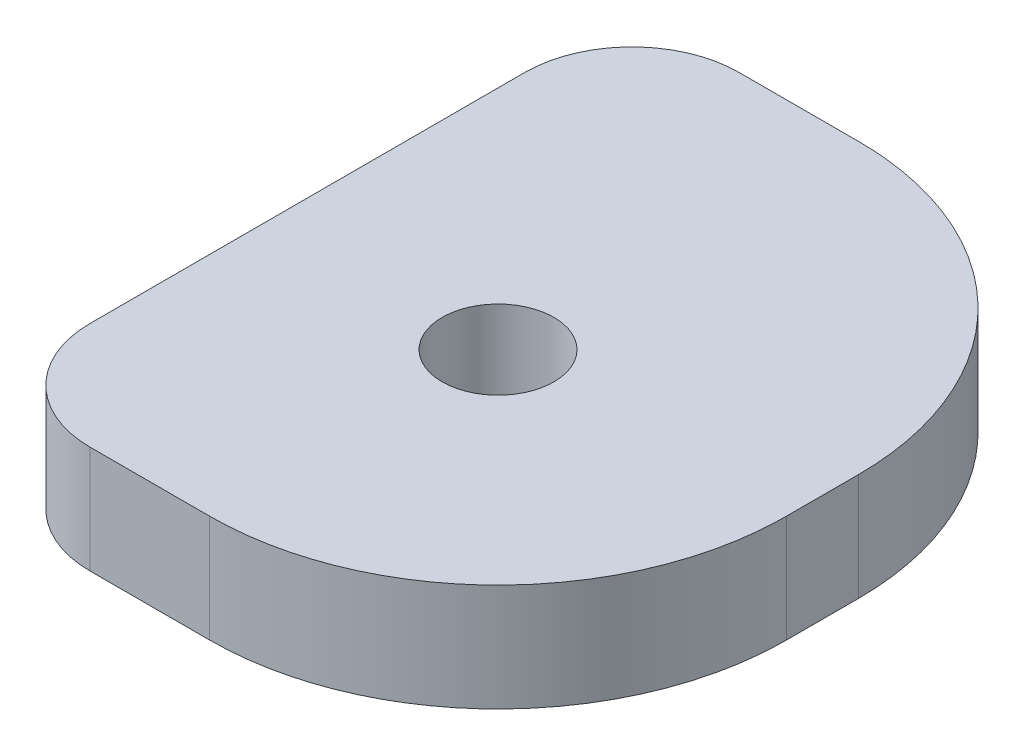
ISO-10303-21;
HEADER;
FILE_DESCRIPTION(('STEP AP214'),'2;1');
FILE_NAME('part.step','',(''),(''),'','','');
FILE_SCHEMA(('AUTOMOTIVE_DESIGN { 1 0 10303 214 1 1 1 1 }'));
ENDSEC;
DATA;
#1=APPLICATION_CONTEXT('core data for automotive mechanical design processes');
#2=APPLICATION_PROTOCOL_DEFINITION('international standard','automotive_design',2000,#1);
#3=PRODUCT_CONTEXT('',#1,'mechanical');
#4=PRODUCT('Part','Part','',(#3));
#5=PRODUCT_RELATED_PRODUCT_CATEGORY('part','',(#4));
#6=PRODUCT_DEFINITION_FORMATION('','',#4);
#7=PRODUCT_DEFINITION_CONTEXT('part definition',#1,'design');
#8=PRODUCT_DEFINITION('design','',#6,#7);
#9=PRODUCT_DEFINITION_SHAPE('','',#8);
#10=(LENGTH_UNIT() NAMED_UNIT(*) SI_UNIT(.MILLI.,.METRE.));
#11=(NAMED_UNIT(*) PLANE_ANGLE_UNIT() SI_UNIT($,.RADIAN.));
#12=(NAMED_UNIT(*) SI_UNIT($,.STERADIAN.) SOLID_ANGLE_UNIT());
#13=UNCERTAINTY_MEASURE_WITH_UNIT(LENGTH_MEASURE(1.E-05),#10,'distance_accuracy_value','');
#14=(GEOMETRIC_REPRESENTATION_CONTEXT(3) GLOBAL_UNCERTAINTY_ASSIGNED_CONTEXT((#13)) GLOBAL_UNIT_ASSIGNED_CONTEXT((#10,
#11,#12)) REPRESENTATION_CONTEXT('',''));
#15=CARTESIAN_POINT('',(0.,0.,0.));
#16=DIRECTION('',(0.,0.,1.));
#17=DIRECTION('',(1.,0.,0.));
#18=AXIS2_PLACEMENT_3D('',#15,#16,#17);
#19=CARTESIAN_POINT('',(-21.3572367696971,3.175,9.59648071784508));
#20=DIRECTION('',(0.,0.,-1.));
#21=DIRECTION('',(-1.,0.,0.));
#22=AXIS2_PLACEMENT_3D('',#19,#20,#21);
#23=PLANE('',#22);
#24=DIRECTION('',(1.,0.,0.));
#25=VECTOR('',#24,1.);
#26=CARTESIAN_POINT('',(-21.3572367696971,3.175,9.59648071784508));
#27=LINE('',#26,#25);
#28=CARTESIAN_POINT('',(9.24976323030285,3.175,9.59648071784508));
#29=VERTEX_POINT('',#28);
#30=CARTESIAN_POINT('',(12.7803632303029,3.175,9.59648071784508));
#31=VERTEX_POINT('',#30);
#32=EDGE_CURVE('E105',#29,#31,#27,.T.);
#33=ORIENTED_EDGE('',*,*,#32,.F.);
#34=DIRECTION('',(0.,-1.,0.));
#35=VECTOR('',#34,1.);
#36=CARTESIAN_POINT('',(9.24976323030285,0.,9.59648071784508));
#37=LINE('',#36,#35);
#38=CARTESIAN_POINT('',(9.24976323030285,0.,9.59648071784508));
#39=VERTEX_POINT('',#38);
#40=EDGE_CURVE('E134',#29,#39,#37,.T.);
#41=ORIENTED_EDGE('',*,*,#40,.T.);
#42=DIRECTION('',(1.,0.,0.));
#43=VECTOR('',#42,1.);
#44=CARTESIAN_POINT('',(-21.3572367696971,0.,9.59648071784508));
#45=LINE('',#44,#43);
#46=CARTESIAN_POINT('',(12.7803632303029,0.,9.59648071784508));
#47=VERTEX_POINT('',#46);
#48=EDGE_CURVE('E162',#39,#47,#45,.T.);
#49=ORIENTED_EDGE('',*,*,#48,.T.);
#50=DIRECTION('',(0.,-1.,0.));
#51=VECTOR('',#50,1.);
#52=CARTESIAN_POINT('',(12.7803632303029,3.175,9.59648071784508));
#53=LINE('',#52,#51);
#54=EDGE_CURVE('E153',#47,#31,#53,.F.);
#55=ORIENTED_EDGE('',*,*,#54,.T.);
#56=EDGE_LOOP('',(#33,#41,#49,#55));
#57=FACE_BOUND('',#56,.T.);
#58=ADVANCED_FACE('F34',(#57),#23,.F.);
#59=CARTESIAN_POINT('',(-21.3572367696971,3.175,-9.60591928215492));
#60=DIRECTION('',(0.,0.,1.));
#61=DIRECTION('',(1.,0.,0.));
#62=AXIS2_PLACEMENT_3D('',#59,#60,#61);
#63=PLANE('',#62);
#64=DIRECTION('',(-1.,0.,0.));
#65=VECTOR('',#64,1.);
#66=CARTESIAN_POINT('',(-21.3572367696971,0.,-9.60591928215492));
#67=LINE('',#66,#65);
#68=CARTESIAN_POINT('',(12.7803632303029,0.,-9.60591928215492));
#69=VERTEX_POINT('',#68);
#70=CARTESIAN_POINT('',(9.24976323030285,0.,-9.60591928215492));
#71=VERTEX_POINT('',#70);
#72=EDGE_CURVE('E154',#69,#71,#67,.T.);
#73=ORIENTED_EDGE('',*,*,#72,.T.);
#74=DIRECTION('',(0.,-1.,0.));
#75=VECTOR('',#74,1.);
#76=CARTESIAN_POINT('',(9.24976323030285,3.175,-9.60591928215492));
#77=LINE('',#76,#75);
#78=CARTESIAN_POINT('',(9.24976323030285,3.175,-9.60591928215492));
#79=VERTEX_POINT('',#78);
#80=EDGE_CURVE('E11',#71,#79,#77,.F.);
#81=ORIENTED_EDGE('',*,*,#80,.T.);
#82=DIRECTION('',(-1.,0.,0.));
#83=VECTOR('',#82,1.);
#84=CARTESIAN_POINT('',(-21.3572367696971,3.175,-9.60591928215492));
#85=LINE('',#84,#83);
#86=CARTESIAN_POINT('',(12.7803632303029,3.175,-9.60591928215492));
#87=VERTEX_POINT('',#86);
#88=EDGE_CURVE('E120',#87,#79,#85,.T.);
#89=ORIENTED_EDGE('',*,*,#88,.F.);
#90=DIRECTION('',(0.,-1.,0.));
#91=VECTOR('',#90,1.);
#92=CARTESIAN_POINT('',(12.7803632303029,3.175,-9.60591928215492));
#93=LINE('',#92,#91);
#94=EDGE_CURVE('E126',#87,#69,#93,.T.);
#95=ORIENTED_EDGE('',*,*,#94,.T.);
#96=EDGE_LOOP('',(#73,#81,#89,#95));
#97=FACE_BOUND('',#96,.T.);
#98=ADVANCED_FACE('F205',(#97),#63,.F.);
#99=CARTESIAN_POINT('',(-0.021236769697146,3.175,-0.00471928215492143));
#100=DIRECTION('',(0.,1.,0.));
#101=DIRECTION('',(0.,0.,1.));
#102=AXIS2_PLACEMENT_3D('',#99,#100,#101);
#103=PLANE('',#102);
#104=CARTESIAN_POINT('',(12.7803632303029,3.175,1.06208071784508));
#105=DIRECTION('',(0.,1.,0.));
#106=DIRECTION('',(0.,0.,1.));
#107=AXIS2_PLACEMENT_3D('',#104,#105,#106);
#108=CIRCLE('',#107,1.65354);
#109=CARTESIAN_POINT('',(12.7803632303029,3.175,2.71562071784508));
#110=VERTEX_POINT('',#109);
#111=EDGE_CURVE('E167',#110,#110,#108,.T.);
#112=ORIENTED_EDGE('',*,*,#111,.F.);
#113=EDGE_LOOP('',(#112));
#114=FACE_BOUND('',#113,.T.);
#115=DIRECTION('',(0.,0.,-1.));
#116=VECTOR('',#115,1.);
#117=CARTESIAN_POINT('',(6.07476323030285,3.175,9.59648071784508));
#118=LINE('',#117,#116);
#119=CARTESIAN_POINT('',(6.07476323030285,3.175,6.42148071784508));
#120=VERTEX_POINT('',#119);
#121=CARTESIAN_POINT('',(6.07476323030285,3.175,-6.43091928215492));
#122=VERTEX_POINT('',#121);
#123=EDGE_CURVE('E147',#120,#122,#118,.T.);
#124=ORIENTED_EDGE('',*,*,#123,.F.);
#125=CARTESIAN_POINT('',(9.24976323030285,3.175,6.42148071784508));
#126=DIRECTION('',(0.,1.,0.));
#127=DIRECTION('',(0.,0.,1.));
#128=AXIS2_PLACEMENT_3D('',#125,#126,#127);
#129=CIRCLE('',#128,3.175);
#130=EDGE_CURVE('E42',#120,#29,#129,.T.);
#131=ORIENTED_EDGE('',*,*,#130,.T.);
#132=ORIENTED_EDGE('',*,*,#32,.T.);
#133=CARTESIAN_POINT('',(12.7803632303029,3.175,9.59648071784508));
#134=CARTESIAN_POINT('',(17.7796990035859,3.175,9.59648071784508));
#135=CARTESIAN_POINT('',(21.3147632303029,3.175,6.06141649112814));
#136=CARTESIAN_POINT('',(21.3147632303029,3.175,1.06208071784508));
#137=(BOUNDED_CURVE() B_SPLINE_CURVE(3,(#133,#134,#135,#136),.UNSPECIFIED.,.F.,
.F.) B_SPLINE_CURVE_WITH_KNOTS((4,4),(0.,1.),
.UNSPECIFIED.) CURVE() GEOMETRIC_REPRESENTATION_ITEM() RATIONAL_B_SPLINE_CURVE((1.,
0.804737854124365,0.804737854124365,1.)) REPRESENTATION_ITEM(''));
#138=CARTESIAN_POINT('',(21.3147632303028,3.175,1.06208071784508));
#139=VERTEX_POINT('',#138);
#140=EDGE_CURVE('E99',#31,#139,#137,.T.);
#141=ORIENTED_EDGE('',*,*,#140,.T.);
#142=DIRECTION('',(0.,0.,-1.));
#143=VECTOR('',#142,1.);
#144=CARTESIAN_POINT('',(21.3147632303029,3.175,-9.60591928215492));
#145=LINE('',#144,#143);
#146=CARTESIAN_POINT('',(21.3147632303029,3.175,-1.07151928215492));
#147=VERTEX_POINT('',#146);
#148=EDGE_CURVE('E102',#139,#147,#145,.T.);
#149=ORIENTED_EDGE('',*,*,#148,.T.);
#150=CARTESIAN_POINT('',(21.3147632303028,3.175,-1.07151928215492));
#151=CARTESIAN_POINT('',(21.3147632303029,3.175,-6.07085505543798));
#152=CARTESIAN_POINT('',(17.7796990035859,3.175,-9.60591928215492));
#153=CARTESIAN_POINT('',(12.7803632303029,3.175,-9.60591928215492));
#154=(BOUNDED_CURVE() B_SPLINE_CURVE(3,(#150,#151,#152,#153),.UNSPECIFIED.,.F.,
.F.) B_SPLINE_CURVE_WITH_KNOTS((4,4),(0.,1.),
.UNSPECIFIED.) CURVE() GEOMETRIC_REPRESENTATION_ITEM() RATIONAL_B_SPLINE_CURVE((1.,
0.804737854124365,0.804737854124365,1.)) REPRESENTATION_ITEM(''));
#155=EDGE_CURVE('E133',#147,#87,#154,.T.);
#156=ORIENTED_EDGE('',*,*,#155,.T.);
#157=ORIENTED_EDGE('',*,*,#88,.T.);
#158=CARTESIAN_POINT('',(9.24976323030285,3.175,-6.43091928215492));
#159=DIRECTION('',(0.,1.,0.));
#160=DIRECTION('',(0.,0.,1.));
#161=AXIS2_PLACEMENT_3D('',#158,#159,#160);
#162=CIRCLE('',#161,3.175);
#163=EDGE_CURVE('E54',#79,#122,#162,.T.);
#164=ORIENTED_EDGE('',*,*,#163,.T.);
#165=EDGE_LOOP('',(#124,#131,#132,#141,#149,#156,#157,#164));
#166=FACE_BOUND('',#165,.T.);
#167=ADVANCED_FACE('F101',(#114,#166),#103,.T.);
#168=CARTESIAN_POINT('',(-0.021236769697146,0.,-0.00471928215492143));
#169=DIRECTION('',(0.,1.,0.));
#170=DIRECTION('',(0.,0.,1.));
#171=AXIS2_PLACEMENT_3D('',#168,#169,#170);
#172=PLANE('',#171);
#173=CARTESIAN_POINT('',(12.7803632303029,0.,1.06208071784508));
#174=DIRECTION('',(0.,1.,0.));
#175=DIRECTION('',(0.,0.,1.));
#176=AXIS2_PLACEMENT_3D('',#173,#174,#175);
#177=CIRCLE('',#176,1.65354);
#178=CARTESIAN_POINT('',(12.7803632303029,0.,2.71562071784508));
#179=VERTEX_POINT('',#178);
#180=EDGE_CURVE('E172',#179,#179,#177,.T.);
#181=ORIENTED_EDGE('',*,*,#180,.T.);
#182=EDGE_LOOP('',(#181));
#183=FACE_BOUND('',#182,.T.);
#184=ORIENTED_EDGE('',*,*,#48,.F.);
#185=CARTESIAN_POINT('',(9.24976323030285,0.,6.42148071784508));
#186=DIRECTION('',(0.,1.,0.));
#187=DIRECTION('',(0.,0.,1.));
#188=AXIS2_PLACEMENT_3D('',#185,#186,#187);
#189=CIRCLE('',#188,3.175);
#190=CARTESIAN_POINT('',(6.07476323030285,0.,6.42148071784508));
#191=VERTEX_POINT('',#190);
#192=EDGE_CURVE('E139',#39,#191,#189,.F.);
#193=ORIENTED_EDGE('',*,*,#192,.T.);
#194=DIRECTION('',(0.,0.,-1.));
#195=VECTOR('',#194,1.);
#196=CARTESIAN_POINT('',(6.07476323030285,0.,9.59648071784508));
#197=LINE('',#196,#195);
#198=CARTESIAN_POINT('',(6.07476323030285,0.,-6.43091928215492));
#199=VERTEX_POINT('',#198);
#200=EDGE_CURVE('E161',#191,#199,#197,.T.);
#201=ORIENTED_EDGE('',*,*,#200,.T.);
#202=CARTESIAN_POINT('',(9.24976323030285,0.,-6.43091928215492));
#203=DIRECTION('',(0.,1.,0.));
#204=DIRECTION('',(0.,0.,1.));
#205=AXIS2_PLACEMENT_3D('',#202,#203,#204);
#206=CIRCLE('',#205,3.175);
#207=EDGE_CURVE('E137',#199,#71,#206,.F.);
#208=ORIENTED_EDGE('',*,*,#207,.T.);
#209=ORIENTED_EDGE('',*,*,#72,.F.);
#210=CARTESIAN_POINT('',(21.3147632303028,0.,-1.07151928215492));
#211=CARTESIAN_POINT('',(21.3147632303029,0.,-6.07085505543798));
#212=CARTESIAN_POINT('',(17.7796990035859,0.,-9.60591928215492));
#213=CARTESIAN_POINT('',(12.7803632303029,0.,-9.60591928215492));
#214=(BOUNDED_CURVE() B_SPLINE_CURVE(3,(#210,#211,#212,#213),.UNSPECIFIED.,.F.,
.F.) B_SPLINE_CURVE_WITH_KNOTS((4,4),(0.,1.),
.UNSPECIFIED.) CURVE() GEOMETRIC_REPRESENTATION_ITEM() RATIONAL_B_SPLINE_CURVE((1.,
0.804737854124365,0.804737854124365,1.)) REPRESENTATION_ITEM(''));
#215=CARTESIAN_POINT('',(21.3147632303029,0.,-1.07151928215492));
#216=VERTEX_POINT('',#215);
#217=EDGE_CURVE('E124',#69,#216,#214,.F.);
#218=ORIENTED_EDGE('',*,*,#217,.T.);
#219=DIRECTION('',(0.,0.,-1.));
#220=VECTOR('',#219,1.);
#221=CARTESIAN_POINT('',(21.3147632303029,0.,-9.60591928215492));
#222=LINE('',#221,#220);
#223=CARTESIAN_POINT('',(21.3147632303028,0.,1.06208071784508));
#224=VERTEX_POINT('',#223);
#225=EDGE_CURVE('E186',#224,#216,#222,.T.);
#226=ORIENTED_EDGE('',*,*,#225,.F.);
#227=CARTESIAN_POINT('',(12.7803632303029,0.,9.59648071784508));
#228=CARTESIAN_POINT('',(17.7796990035859,0.,9.59648071784508));
#229=CARTESIAN_POINT('',(21.3147632303029,0.,6.06141649112814));
#230=CARTESIAN_POINT('',(21.3147632303029,0.,1.06208071784508));
#231=(BOUNDED_CURVE() B_SPLINE_CURVE(3,(#227,#228,#229,#230),.UNSPECIFIED.,.F.,
.F.) B_SPLINE_CURVE_WITH_KNOTS((4,4),(0.,1.),
.UNSPECIFIED.) CURVE() GEOMETRIC_REPRESENTATION_ITEM() RATIONAL_B_SPLINE_CURVE((1.,
0.804737854124365,0.804737854124365,1.)) REPRESENTATION_ITEM(''));
#232=EDGE_CURVE('E111',#224,#47,#231,.F.);
#233=ORIENTED_EDGE('',*,*,#232,.T.);
#234=EDGE_LOOP('',(#184,#193,#201,#208,#209,#218,#226,#233));
#235=FACE_BOUND('',#234,.T.);
#236=ADVANCED_FACE('F160',(#183,#235),#172,.F.);
#237=CARTESIAN_POINT('',(21.3147632303029,3.175,-9.60591928215492));
#238=DIRECTION('',(-1.,0.,0.));
#239=DIRECTION('',(0.,0.,1.));
#240=AXIS2_PLACEMENT_3D('',#237,#238,#239);
#241=PLANE('',#240);
#242=ORIENTED_EDGE('',*,*,#225,.T.);
#243=DIRECTION('',(0.,-1.,0.));
#244=VECTOR('',#243,1.);
#245=CARTESIAN_POINT('',(21.3147632303029,3.175,-1.07151928215492));
#246=LINE('',#245,#244);
#247=EDGE_CURVE('E119',#216,#147,#246,.F.);
#248=ORIENTED_EDGE('',*,*,#247,.T.);
#249=ORIENTED_EDGE('',*,*,#148,.F.);
#250=DIRECTION('',(0.,-1.,0.));
#251=VECTOR('',#250,1.);
#252=CARTESIAN_POINT('',(21.3147632303028,3.175,1.06208071784508));
#253=LINE('',#252,#251);
#254=EDGE_CURVE('E110',#139,#224,#253,.T.);
#255=ORIENTED_EDGE('',*,*,#254,.T.);
#256=EDGE_LOOP('',(#242,#248,#249,#255));
#257=FACE_BOUND('',#256,.T.);
#258=ADVANCED_FACE('F116',(#257),#241,.F.);
#259=CARTESIAN_POINT('',(12.7803632303029,3.175,1.06208071784508));
#260=DIRECTION('',(0.,-1.,0.));
#261=DIRECTION('',(0.,0.,-1.));
#262=AXIS2_PLACEMENT_3D('',#259,#260,#261);
#263=CYLINDRICAL_SURFACE('',#262,8.5344);
#264=ORIENTED_EDGE('',*,*,#140,.F.);
#265=ORIENTED_EDGE('',*,*,#54,.F.);
#266=ORIENTED_EDGE('',*,*,#232,.F.);
#267=ORIENTED_EDGE('',*,*,#254,.F.);
#268=EDGE_LOOP('',(#264,#265,#266,#267));
#269=FACE_BOUND('',#268,.T.);
#270=ADVANCED_FACE('F122',(#269),#263,.T.);
#271=CARTESIAN_POINT('',(12.7803632303029,0.,1.06208071784508));
#272=DIRECTION('',(0.,1.,0.));
#273=DIRECTION('',(0.,0.,1.));
#274=AXIS2_PLACEMENT_3D('',#271,#272,#273);
#275=CYLINDRICAL_SURFACE('',#274,1.65354);
#276=ORIENTED_EDGE('',*,*,#180,.F.);
#277=EDGE_LOOP('',(#276));
#278=FACE_BOUND('',#277,.T.);
#279=ORIENTED_EDGE('',*,*,#111,.T.);
#280=EDGE_LOOP('',(#279));
#281=FACE_BOUND('',#280,.T.);
#282=ADVANCED_FACE('F229',(#278,#281),#275,.F.);
#283=CARTESIAN_POINT('',(12.7803632303029,3.175,-1.07151928215492));
#284=DIRECTION('',(0.,-1.,0.));
#285=DIRECTION('',(0.,0.,-1.));
#286=AXIS2_PLACEMENT_3D('',#283,#284,#285);
#287=CYLINDRICAL_SURFACE('',#286,8.5344);
#288=ORIENTED_EDGE('',*,*,#155,.F.);
#289=ORIENTED_EDGE('',*,*,#247,.F.);
#290=ORIENTED_EDGE('',*,*,#217,.F.);
#291=ORIENTED_EDGE('',*,*,#94,.F.);
#292=EDGE_LOOP('',(#288,#289,#290,#291));
#293=FACE_BOUND('',#292,.T.);
#294=ADVANCED_FACE('F203',(#293),#287,.T.);
#295=CARTESIAN_POINT('',(6.07476323030285,3.175,9.59648071784508));
#296=DIRECTION('',(-1.,0.,0.));
#297=DIRECTION('',(0.,0.,1.));
#298=AXIS2_PLACEMENT_3D('',#295,#296,#297);
#299=PLANE('',#298);
#300=ORIENTED_EDGE('',*,*,#200,.F.);
#301=DIRECTION('',(0.,-1.,0.));
#302=VECTOR('',#301,1.);
#303=CARTESIAN_POINT('',(6.07476323030285,3.175,6.42148071784508));
#304=LINE('',#303,#302);
#305=EDGE_CURVE('E144',#191,#120,#304,.F.);
#306=ORIENTED_EDGE('',*,*,#305,.T.);
#307=ORIENTED_EDGE('',*,*,#123,.T.);
#308=DIRECTION('',(0.,-1.,0.));
#309=VECTOR('',#308,1.);
#310=CARTESIAN_POINT('',(6.07476323030285,0.,-6.43091928215492));
#311=LINE('',#310,#309);
#312=EDGE_CURVE('E141',#122,#199,#311,.T.);
#313=ORIENTED_EDGE('',*,*,#312,.T.);
#314=EDGE_LOOP('',(#300,#306,#307,#313));
#315=FACE_BOUND('',#314,.T.);
#316=ADVANCED_FACE('F164',(#315),#299,.T.);
#317=CARTESIAN_POINT('',(9.24976323030285,3.175,6.42148071784508));
#318=DIRECTION('',(0.,1.,0.));
#319=DIRECTION('',(0.,0.,1.));
#320=AXIS2_PLACEMENT_3D('',#317,#318,#319);
#321=CYLINDRICAL_SURFACE('',#320,3.175);
#322=ORIENTED_EDGE('',*,*,#130,.F.);
#323=ORIENTED_EDGE('',*,*,#305,.F.);
#324=ORIENTED_EDGE('',*,*,#192,.F.);
#325=ORIENTED_EDGE('',*,*,#40,.F.);
#326=EDGE_LOOP('',(#322,#323,#324,#325));
#327=FACE_BOUND('',#326,.T.);
#328=ADVANCED_FACE('F156',(#327),#321,.T.);
#329=CARTESIAN_POINT('',(9.24976323030285,3.175,-6.43091928215492));
#330=DIRECTION('',(0.,1.,0.));
#331=DIRECTION('',(0.,0.,1.));
#332=AXIS2_PLACEMENT_3D('',#329,#330,#331);
#333=CYLINDRICAL_SURFACE('',#332,3.175);
#334=ORIENTED_EDGE('',*,*,#163,.F.);
#335=ORIENTED_EDGE('',*,*,#80,.F.);
#336=ORIENTED_EDGE('',*,*,#207,.F.);
#337=ORIENTED_EDGE('',*,*,#312,.F.);
#338=EDGE_LOOP('',(#334,#335,#336,#337));
#339=FACE_BOUND('',#338,.T.);
#340=ADVANCED_FACE('F36',(#339),#333,.T.);
#341=CLOSED_SHELL('',(#58,#98,#167,#236,#258,#270,#282,#294,#316,#328,#340));
#342=MANIFOLD_SOLID_BREP('B2',#341);
#343=ADVANCED_BREP_SHAPE_REPRESENTATION('',(#18,#342),#14);
#344=SHAPE_DEFINITION_REPRESENTATION(#9,#343);
ENDSEC;
END-ISO-10303-21;
